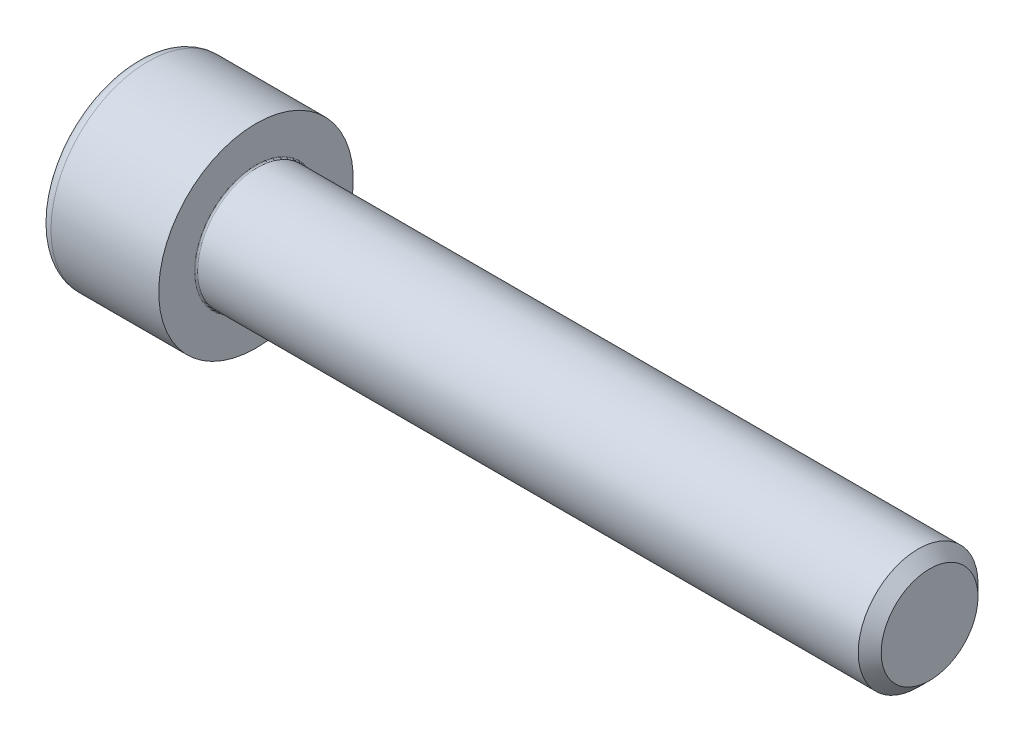
ISO-10303-21;
HEADER;
FILE_DESCRIPTION(('STEP AP214'),'2;1');
FILE_NAME('part.step','',(''),(''),'','','');
FILE_SCHEMA(('AUTOMOTIVE_DESIGN { 1 0 10303 214 1 1 1 1 }'));
ENDSEC;
DATA;
#1=APPLICATION_CONTEXT('core data for automotive mechanical design processes');
#2=APPLICATION_PROTOCOL_DEFINITION('international standard','automotive_design',2000,#1);
#3=PRODUCT_CONTEXT('',#1,'mechanical');
#4=PRODUCT('Part','Part','',(#3));
#5=PRODUCT_RELATED_PRODUCT_CATEGORY('part','',(#4));
#6=PRODUCT_DEFINITION_FORMATION('','',#4);
#7=PRODUCT_DEFINITION_CONTEXT('part definition',#1,'design');
#8=PRODUCT_DEFINITION('design','',#6,#7);
#9=PRODUCT_DEFINITION_SHAPE('','',#8);
#10=(LENGTH_UNIT() NAMED_UNIT(*) SI_UNIT(.MILLI.,.METRE.));
#11=(NAMED_UNIT(*) PLANE_ANGLE_UNIT() SI_UNIT($,.RADIAN.));
#12=(NAMED_UNIT(*) SI_UNIT($,.STERADIAN.) SOLID_ANGLE_UNIT());
#13=UNCERTAINTY_MEASURE_WITH_UNIT(LENGTH_MEASURE(1.E-05),#10,'distance_accuracy_value','');
#14=(GEOMETRIC_REPRESENTATION_CONTEXT(3) GLOBAL_UNCERTAINTY_ASSIGNED_CONTEXT((#13)) GLOBAL_UNIT_ASSIGNED_CONTEXT((#10,
#11,#12)) REPRESENTATION_CONTEXT('',''));
#15=CARTESIAN_POINT('',(0.,0.,0.));
#16=DIRECTION('',(0.,0.,1.));
#17=DIRECTION('',(1.,0.,0.));
#18=AXIS2_PLACEMENT_3D('',#15,#16,#17);
#19=CARTESIAN_POINT('',(-3.,0.,0.));
#20=DIRECTION('',(-1.,0.,0.));
#21=DIRECTION('',(0.,1.,0.));
#22=AXIS2_PLACEMENT_3D('',#19,#20,#21);
#23=CONICAL_SURFACE('',#22,1.73205080756888,1.0471975511966);
#24=DIRECTION('',(-0.5,-0.866025403784438,0.));
#25=VECTOR('',#24,1.);
#26=CARTESIAN_POINT('',(-3.,-1.73205080756888,0.));
#27=LINE('',#26,#25);
#28=CARTESIAN_POINT('',(-2.,0.,0.));
#29=VERTEX_POINT('',#28);
#30=CARTESIAN_POINT('',(-3.73205080756888,-3.,0.));
#31=VERTEX_POINT('',#30);
#32=EDGE_CURVE('E11',#29,#31,#27,.T.);
#33=ORIENTED_EDGE('',*,*,#32,.T.);
#34=CARTESIAN_POINT('',(-3.73205080756888,-3.,0.));
#35=CARTESIAN_POINT('',(-3.73205080756888,-3.,0.80384757729336));
#36=CARTESIAN_POINT('',(-4.,-3.,1.73205080756886));
#37=(BOUNDED_CURVE() B_SPLINE_CURVE(2,(#34,#35,#36),.UNSPECIFIED.,.F.,
.F.) B_SPLINE_CURVE_WITH_KNOTS((3,3),(0.175265420711685,0.350530841423371),
.UNSPECIFIED.) CURVE() GEOMETRIC_REPRESENTATION_ITEM() RATIONAL_B_SPLINE_CURVE((1.07735026918962,
1.07735026918962,1.)) REPRESENTATION_ITEM(''));
#38=CARTESIAN_POINT('',(-4.,-3.,1.73205080756888));
#39=VERTEX_POINT('',#38);
#40=EDGE_CURVE('E177',#31,#39,#37,.T.);
#41=ORIENTED_EDGE('',*,*,#40,.T.);
#42=CARTESIAN_POINT('',(-4.,-3.,1.73205080756889));
#43=CARTESIAN_POINT('',(-3.50000000000001,-1.5,2.59807621135332));
#44=CARTESIAN_POINT('',(-4.,0.,3.46410161513774));
#45=(BOUNDED_CURVE() B_SPLINE_CURVE(2,(#42,#43,#44),.UNSPECIFIED.,.F.,
.F.) B_SPLINE_CURVE_WITH_KNOTS((3,3),(0.,0.350530841423371),
.UNSPECIFIED.) CURVE() GEOMETRIC_REPRESENTATION_ITEM() RATIONAL_B_SPLINE_CURVE((1.,
1.15470053837925,1.)) REPRESENTATION_ITEM(''));
#46=CARTESIAN_POINT('',(-4.,0.,3.46410161513775));
#47=VERTEX_POINT('',#46);
#48=EDGE_CURVE('E28',#39,#47,#45,.T.);
#49=ORIENTED_EDGE('',*,*,#48,.T.);
#50=CARTESIAN_POINT('',(-4.,0.,3.46410161513774));
#51=CARTESIAN_POINT('',(-3.5,1.5,2.59807621135334));
#52=CARTESIAN_POINT('',(-4.,3.,1.73205080756889));
#53=(BOUNDED_CURVE() B_SPLINE_CURVE(2,(#50,#51,#52),.UNSPECIFIED.,.F.,
.F.) B_SPLINE_CURVE_WITH_KNOTS((3,3),(0.,0.350530841423371),
.UNSPECIFIED.) CURVE() GEOMETRIC_REPRESENTATION_ITEM() RATIONAL_B_SPLINE_CURVE((1.,
1.15470053837924,1.)) REPRESENTATION_ITEM(''));
#54=CARTESIAN_POINT('',(-4.,3.,1.73205080756888));
#55=VERTEX_POINT('',#54);
#56=EDGE_CURVE('E170',#47,#55,#53,.T.);
#57=ORIENTED_EDGE('',*,*,#56,.T.);
#58=CARTESIAN_POINT('',(-4.,3.,1.73205080756886));
#59=CARTESIAN_POINT('',(-3.5,3.,0.));
#60=CARTESIAN_POINT('',(-4.,3.,-1.73205080756886));
#61=(BOUNDED_CURVE() B_SPLINE_CURVE(2,(#58,#59,#60),.UNSPECIFIED.,.F.,
.F.) B_SPLINE_CURVE_WITH_KNOTS((3,3),(0.,0.350530841423371),
.UNSPECIFIED.) CURVE() GEOMETRIC_REPRESENTATION_ITEM() RATIONAL_B_SPLINE_CURVE((1.,
1.15470053837924,1.)) REPRESENTATION_ITEM(''));
#62=CARTESIAN_POINT('',(-4.,3.,-1.73205080756888));
#63=VERTEX_POINT('',#62);
#64=EDGE_CURVE('E171',#55,#63,#61,.T.);
#65=ORIENTED_EDGE('',*,*,#64,.T.);
#66=CARTESIAN_POINT('',(-4.,3.,-1.73205080756889));
#67=CARTESIAN_POINT('',(-3.50000000000001,1.5,-2.59807621135332));
#68=CARTESIAN_POINT('',(-4.,0.,-3.46410161513774));
#69=(BOUNDED_CURVE() B_SPLINE_CURVE(2,(#66,#67,#68),.UNSPECIFIED.,.F.,
.F.) B_SPLINE_CURVE_WITH_KNOTS((3,3),(0.,0.350530841423371),
.UNSPECIFIED.) CURVE() GEOMETRIC_REPRESENTATION_ITEM() RATIONAL_B_SPLINE_CURVE((1.,
1.15470053837925,1.)) REPRESENTATION_ITEM(''));
#70=CARTESIAN_POINT('',(-4.,0.,-3.46410161513775));
#71=VERTEX_POINT('',#70);
#72=EDGE_CURVE('E191',#63,#71,#69,.T.);
#73=ORIENTED_EDGE('',*,*,#72,.T.);
#74=CARTESIAN_POINT('',(-4.,0.,-3.46410161513774));
#75=CARTESIAN_POINT('',(-3.5,-1.5,-2.59807621135334));
#76=CARTESIAN_POINT('',(-4.,-3.,-1.73205080756889));
#77=(BOUNDED_CURVE() B_SPLINE_CURVE(2,(#74,#75,#76),.UNSPECIFIED.,.F.,
.F.) B_SPLINE_CURVE_WITH_KNOTS((3,3),(0.,0.350530841423371),
.UNSPECIFIED.) CURVE() GEOMETRIC_REPRESENTATION_ITEM() RATIONAL_B_SPLINE_CURVE((1.,
1.15470053837924,1.)) REPRESENTATION_ITEM(''));
#78=CARTESIAN_POINT('',(-4.,-3.,-1.73205080756888));
#79=VERTEX_POINT('',#78);
#80=EDGE_CURVE('E161',#71,#79,#77,.T.);
#81=ORIENTED_EDGE('',*,*,#80,.T.);
#82=CARTESIAN_POINT('',(-4.,-3.,-1.73205080756885));
#83=CARTESIAN_POINT('',(-3.73205080756888,-3.,-0.80384757729336));
#84=CARTESIAN_POINT('',(-3.73205080756888,-3.,0.));
#85=(BOUNDED_CURVE() B_SPLINE_CURVE(2,(#82,#83,#84),.UNSPECIFIED.,.F.,
.F.) B_SPLINE_CURVE_WITH_KNOTS((3,3),(0.,0.175265420711685),
.UNSPECIFIED.) CURVE() GEOMETRIC_REPRESENTATION_ITEM() RATIONAL_B_SPLINE_CURVE((1.,
1.07735026918962,1.07735026918962)) REPRESENTATION_ITEM(''));
#86=EDGE_CURVE('E211',#79,#31,#85,.T.);
#87=ORIENTED_EDGE('',*,*,#86,.T.);
#88=ORIENTED_EDGE('',*,*,#32,.F.);
#89=EDGE_LOOP('',(#33,#41,#49,#57,#65,#73,#81,#87,#88));
#90=FACE_BOUND('',#89,.T.);
#91=ADVANCED_FACE('F17',(#90),#23,.F.);
#92=CARTESIAN_POINT('',(-8.,-3.,1.73205080756888));
#93=DIRECTION('',(0.,-0.5,0.866025403784439));
#94=DIRECTION('',(-1.,0.,0.));
#95=AXIS2_PLACEMENT_3D('',#92,#93,#94);
#96=PLANE('',#95);
#97=ORIENTED_EDGE('',*,*,#48,.F.);
#98=DIRECTION('',(-1.,0.,0.));
#99=VECTOR('',#98,1.);
#100=CARTESIAN_POINT('',(-6.,-3.,1.73205080756888));
#101=LINE('',#100,#99);
#102=CARTESIAN_POINT('',(-8.,-3.,1.73205080756888));
#103=VERTEX_POINT('',#102);
#104=EDGE_CURVE('E183',#39,#103,#101,.T.);
#105=ORIENTED_EDGE('',*,*,#104,.T.);
#106=DIRECTION('',(0.,-0.866025403784439,-0.5));
#107=VECTOR('',#106,1.);
#108=CARTESIAN_POINT('',(-8.,-2.25,2.1650635094611));
#109=LINE('',#108,#107);
#110=CARTESIAN_POINT('',(-8.,0.,3.46410161513775));
#111=VERTEX_POINT('',#110);
#112=EDGE_CURVE('E176',#111,#103,#109,.T.);
#113=ORIENTED_EDGE('',*,*,#112,.F.);
#114=DIRECTION('',(1.,0.,0.));
#115=VECTOR('',#114,1.);
#116=CARTESIAN_POINT('',(-6.,0.,3.46410161513775));
#117=LINE('',#116,#115);
#118=EDGE_CURVE('E260',#111,#47,#117,.T.);
#119=ORIENTED_EDGE('',*,*,#118,.T.);
#120=EDGE_LOOP('',(#97,#105,#113,#119));
#121=FACE_BOUND('',#120,.T.);
#122=ADVANCED_FACE('F317',(#121),#96,.F.);
#123=CARTESIAN_POINT('',(-8.,-3.,-1.73205080756888));
#124=DIRECTION('',(0.,-1.,0.));
#125=DIRECTION('',(-1.,0.,0.));
#126=AXIS2_PLACEMENT_3D('',#123,#124,#125);
#127=PLANE('',#126);
#128=ORIENTED_EDGE('',*,*,#86,.F.);
#129=DIRECTION('',(-1.,0.,0.));
#130=VECTOR('',#129,1.);
#131=CARTESIAN_POINT('',(-6.,-3.,-1.73205080756888));
#132=LINE('',#131,#130);
#133=CARTESIAN_POINT('',(-8.,-3.,-1.73205080756888));
#134=VERTEX_POINT('',#133);
#135=EDGE_CURVE('E160',#79,#134,#132,.T.);
#136=ORIENTED_EDGE('',*,*,#135,.T.);
#137=DIRECTION('',(0.,0.,-1.));
#138=VECTOR('',#137,1.);
#139=CARTESIAN_POINT('',(-8.,-3.,-0.866025403784438));
#140=LINE('',#139,#138);
#141=EDGE_CURVE('E242',#103,#134,#140,.T.);
#142=ORIENTED_EDGE('',*,*,#141,.F.);
#143=ORIENTED_EDGE('',*,*,#104,.F.);
#144=ORIENTED_EDGE('',*,*,#40,.F.);
#145=EDGE_LOOP('',(#128,#136,#142,#143,#144));
#146=FACE_BOUND('',#145,.T.);
#147=ADVANCED_FACE('F321',(#146),#127,.F.);
#148=CARTESIAN_POINT('',(-8.,0.,3.46410161513775));
#149=DIRECTION('',(0.,0.5,0.866025403784439));
#150=DIRECTION('',(1.,0.,0.));
#151=AXIS2_PLACEMENT_3D('',#148,#149,#150);
#152=PLANE('',#151);
#153=ORIENTED_EDGE('',*,*,#56,.F.);
#154=ORIENTED_EDGE('',*,*,#118,.F.);
#155=DIRECTION('',(0.,-0.866025403784439,0.5));
#156=VECTOR('',#155,1.);
#157=CARTESIAN_POINT('',(-8.,0.75,3.03108891324554));
#158=LINE('',#157,#156);
#159=CARTESIAN_POINT('',(-8.,3.,1.73205080756888));
#160=VERTEX_POINT('',#159);
#161=EDGE_CURVE('E172',#160,#111,#158,.T.);
#162=ORIENTED_EDGE('',*,*,#161,.F.);
#163=DIRECTION('',(-1.,0.,0.));
#164=VECTOR('',#163,1.);
#165=CARTESIAN_POINT('',(-6.,3.,1.73205080756888));
#166=LINE('',#165,#164);
#167=EDGE_CURVE('E166',#55,#160,#166,.T.);
#168=ORIENTED_EDGE('',*,*,#167,.F.);
#169=EDGE_LOOP('',(#153,#154,#162,#168));
#170=FACE_BOUND('',#169,.T.);
#171=ADVANCED_FACE('F315',(#170),#152,.F.);
#172=CARTESIAN_POINT('',(-8.,3.,1.73205080756888));
#173=DIRECTION('',(0.,1.,0.));
#174=DIRECTION('',(0.,0.,-1.));
#175=AXIS2_PLACEMENT_3D('',#172,#173,#174);
#176=PLANE('',#175);
#177=ORIENTED_EDGE('',*,*,#64,.F.);
#178=ORIENTED_EDGE('',*,*,#167,.T.);
#179=DIRECTION('',(0.,0.,1.));
#180=VECTOR('',#179,1.);
#181=CARTESIAN_POINT('',(-8.,3.,0.866025403784437));
#182=LINE('',#181,#180);
#183=CARTESIAN_POINT('',(-8.,3.,-1.73205080756888));
#184=VERTEX_POINT('',#183);
#185=EDGE_CURVE('E155',#184,#160,#182,.T.);
#186=ORIENTED_EDGE('',*,*,#185,.F.);
#187=DIRECTION('',(-1.,0.,0.));
#188=VECTOR('',#187,1.);
#189=CARTESIAN_POINT('',(-6.,3.,-1.73205080756888));
#190=LINE('',#189,#188);
#191=EDGE_CURVE('E196',#63,#184,#190,.T.);
#192=ORIENTED_EDGE('',*,*,#191,.F.);
#193=EDGE_LOOP('',(#177,#178,#186,#192));
#194=FACE_BOUND('',#193,.T.);
#195=ADVANCED_FACE('F312',(#194),#176,.F.);
#196=CARTESIAN_POINT('',(-8.,3.,-1.73205080756888));
#197=DIRECTION('',(0.,0.5,-0.866025403784439));
#198=DIRECTION('',(-1.,0.,0.));
#199=AXIS2_PLACEMENT_3D('',#196,#197,#198);
#200=PLANE('',#199);
#201=ORIENTED_EDGE('',*,*,#72,.F.);
#202=ORIENTED_EDGE('',*,*,#191,.T.);
#203=DIRECTION('',(0.,0.866025403784439,0.5));
#204=VECTOR('',#203,1.);
#205=CARTESIAN_POINT('',(-8.,2.25,-2.1650635094611));
#206=LINE('',#205,#204);
#207=CARTESIAN_POINT('',(-8.,0.,-3.46410161513775));
#208=VERTEX_POINT('',#207);
#209=EDGE_CURVE('E190',#208,#184,#206,.T.);
#210=ORIENTED_EDGE('',*,*,#209,.F.);
#211=DIRECTION('',(-1.,0.,0.));
#212=VECTOR('',#211,1.);
#213=CARTESIAN_POINT('',(-6.,0.,-3.46410161513775));
#214=LINE('',#213,#212);
#215=EDGE_CURVE('E157',#71,#208,#214,.T.);
#216=ORIENTED_EDGE('',*,*,#215,.F.);
#217=EDGE_LOOP('',(#201,#202,#210,#216));
#218=FACE_BOUND('',#217,.T.);
#219=ADVANCED_FACE('F302',(#218),#200,.F.);
#220=CARTESIAN_POINT('',(-8.,0.,-3.46410161513775));
#221=DIRECTION('',(0.,-0.5,-0.866025403784439));
#222=DIRECTION('',(0.,-0.866025403784439,0.5));
#223=AXIS2_PLACEMENT_3D('',#220,#221,#222);
#224=PLANE('',#223);
#225=ORIENTED_EDGE('',*,*,#80,.F.);
#226=ORIENTED_EDGE('',*,*,#215,.T.);
#227=DIRECTION('',(0.,0.866025403784439,-0.5));
#228=VECTOR('',#227,1.);
#229=CARTESIAN_POINT('',(-8.,-0.75,-3.03108891324554));
#230=LINE('',#229,#228);
#231=EDGE_CURVE('E151',#134,#208,#230,.T.);
#232=ORIENTED_EDGE('',*,*,#231,.F.);
#233=ORIENTED_EDGE('',*,*,#135,.F.);
#234=EDGE_LOOP('',(#225,#226,#232,#233));
#235=FACE_BOUND('',#234,.T.);
#236=ADVANCED_FACE('F325',(#235),#224,.F.);
#237=CARTESIAN_POINT('',(-4.,0.,0.));
#238=DIRECTION('',(1.,0.,0.));
#239=DIRECTION('',(0.,1.,0.));
#240=AXIS2_PLACEMENT_3D('',#237,#238,#239);
#241=CYLINDRICAL_SURFACE('',#240,6.5);
#242=CARTESIAN_POINT('',(0.,0.,0.));
#243=DIRECTION('',(1.,0.,0.));
#244=DIRECTION('',(0.,1.,0.));
#245=AXIS2_PLACEMENT_3D('',#242,#243,#244);
#246=CIRCLE('',#245,6.5);
#247=CARTESIAN_POINT('',(0.,-6.5,0.));
#248=VERTEX_POINT('',#247);
#249=EDGE_CURVE('E202',#248,#248,#246,.T.);
#250=ORIENTED_EDGE('',*,*,#249,.F.);
#251=DIRECTION('',(-1.,0.,0.));
#252=VECTOR('',#251,1.);
#253=CARTESIAN_POINT('',(-4.,-6.5,0.));
#254=LINE('',#253,#252);
#255=CARTESIAN_POINT('',(-7.2,-6.5,0.));
#256=VERTEX_POINT('',#255);
#257=EDGE_CURVE('E184',#248,#256,#254,.T.);
#258=ORIENTED_EDGE('',*,*,#257,.T.);
#259=CARTESIAN_POINT('',(-7.2,0.,0.));
#260=DIRECTION('',(-1.,0.,0.));
#261=DIRECTION('',(0.,-1.,0.));
#262=AXIS2_PLACEMENT_3D('',#259,#260,#261);
#263=CIRCLE('',#262,6.5);
#264=CARTESIAN_POINT('',(-7.2,0.,6.5));
#265=VERTEX_POINT('',#264);
#266=EDGE_CURVE('E203',#265,#256,#263,.T.);
#267=ORIENTED_EDGE('',*,*,#266,.F.);
#268=CARTESIAN_POINT('',(-7.2,0.,0.));
#269=DIRECTION('',(-1.,0.,0.));
#270=DIRECTION('',(0.,-1.,0.));
#271=AXIS2_PLACEMENT_3D('',#268,#269,#270);
#272=CIRCLE('',#271,6.5);
#273=EDGE_CURVE('E207',#256,#265,#272,.T.);
#274=ORIENTED_EDGE('',*,*,#273,.F.);
#275=ORIENTED_EDGE('',*,*,#257,.F.);
#276=EDGE_LOOP('',(#250,#258,#267,#274,#275));
#277=FACE_BOUND('',#276,.T.);
#278=ADVANCED_FACE('F19',(#277),#241,.T.);
#279=CARTESIAN_POINT('',(-8.,4.98205080756888,0.));
#280=DIRECTION('',(-1.,0.,0.));
#281=DIRECTION('',(0.,0.,1.));
#282=AXIS2_PLACEMENT_3D('',#279,#280,#281);
#283=PLANE('',#282);
#284=ORIENTED_EDGE('',*,*,#185,.T.);
#285=ORIENTED_EDGE('',*,*,#161,.T.);
#286=ORIENTED_EDGE('',*,*,#112,.T.);
#287=ORIENTED_EDGE('',*,*,#141,.T.);
#288=ORIENTED_EDGE('',*,*,#231,.T.);
#289=ORIENTED_EDGE('',*,*,#209,.T.);
#290=EDGE_LOOP('',(#284,#285,#286,#287,#288,#289));
#291=FACE_BOUND('',#290,.T.);
#292=CARTESIAN_POINT('',(-8.,0.,0.));
#293=DIRECTION('',(1.,0.,0.));
#294=DIRECTION('',(0.,-1.,0.));
#295=AXIS2_PLACEMENT_3D('',#292,#293,#294);
#296=CIRCLE('',#295,5.7);
#297=CARTESIAN_POINT('',(-8.,0.,5.7));
#298=VERTEX_POINT('',#297);
#299=EDGE_CURVE('E153',#298,#298,#296,.T.);
#300=ORIENTED_EDGE('',*,*,#299,.F.);
#301=EDGE_LOOP('',(#300));
#302=FACE_BOUND('',#301,.T.);
#303=ADVANCED_FACE('F309',(#291,#302),#283,.T.);
#304=CARTESIAN_POINT('',(-7.2,0.,0.));
#305=DIRECTION('',(1.,0.,0.));
#306=DIRECTION('',(0.,0.,-1.));
#307=AXIS2_PLACEMENT_3D('',#304,#305,#306);
#308=TOROIDAL_SURFACE('',#307,5.7,0.8);
#309=ORIENTED_EDGE('',*,*,#266,.T.);
#310=ORIENTED_EDGE('',*,*,#273,.T.);
#311=CARTESIAN_POINT('',(-7.2,0.,5.7));
#312=DIRECTION('',(0.,-1.,0.));
#313=DIRECTION('',(0.,0.,1.));
#314=AXIS2_PLACEMENT_3D('',#311,#312,#313);
#315=CIRCLE('',#314,0.8);
#316=EDGE_CURVE('E156',#265,#298,#315,.T.);
#317=ORIENTED_EDGE('',*,*,#316,.T.);
#318=ORIENTED_EDGE('',*,*,#299,.T.);
#319=ORIENTED_EDGE('',*,*,#316,.F.);
#320=EDGE_LOOP('',(#309,#310,#317,#318,#319));
#321=FACE_BOUND('',#320,.T.);
#322=ADVANCED_FACE('F352',(#321),#308,.T.);
#323=CARTESIAN_POINT('',(45.,2.,0.));
#324=DIRECTION('',(1.,0.,0.));
#325=DIRECTION('',(0.,-1.,0.));
#326=AXIS2_PLACEMENT_3D('',#323,#324,#325);
#327=PLANE('',#326);
#328=CARTESIAN_POINT('',(45.,0.,0.));
#329=DIRECTION('',(-1.,0.,0.));
#330=DIRECTION('',(0.,-1.,0.));
#331=AXIS2_PLACEMENT_3D('',#328,#329,#330);
#332=CIRCLE('',#331,3.2331875);
#333=CARTESIAN_POINT('',(45.,3.2331875,0.));
#334=VERTEX_POINT('',#333);
#335=EDGE_CURVE('E218',#334,#334,#332,.T.);
#336=ORIENTED_EDGE('',*,*,#335,.F.);
#337=EDGE_LOOP('',(#336));
#338=FACE_BOUND('',#337,.T.);
#339=ADVANCED_FACE('F350',(#338),#327,.T.);
#340=CARTESIAN_POINT('',(44.61659375,0.,0.));
#341=DIRECTION('',(-1.,0.,0.));
#342=DIRECTION('',(0.,-1.,0.));
#343=AXIS2_PLACEMENT_3D('',#340,#341,#342);
#344=CONICAL_SURFACE('',#343,3.61659375,0.785398163397448);
#345=ORIENTED_EDGE('',*,*,#335,.T.);
#346=DIRECTION('',(-0.707106781186548,0.707106781186548,0.));
#347=VECTOR('',#346,1.);
#348=CARTESIAN_POINT('',(44.61659375,3.61659375,0.));
#349=LINE('',#348,#347);
#350=CARTESIAN_POINT('',(44.2331875,4.,0.));
#351=VERTEX_POINT('',#350);
#352=EDGE_CURVE('E208',#334,#351,#349,.T.);
#353=ORIENTED_EDGE('',*,*,#352,.T.);
#354=CARTESIAN_POINT('',(44.2331875,0.,0.));
#355=DIRECTION('',(1.,0.,0.));
#356=DIRECTION('',(0.,-1.,0.));
#357=AXIS2_PLACEMENT_3D('',#354,#355,#356);
#358=CIRCLE('',#357,4.);
#359=CARTESIAN_POINT('',(44.2331875,-4.,0.));
#360=VERTEX_POINT('',#359);
#361=EDGE_CURVE('E130',#351,#360,#358,.T.);
#362=ORIENTED_EDGE('',*,*,#361,.T.);
#363=CARTESIAN_POINT('',(44.2331875,0.,0.));
#364=DIRECTION('',(1.,0.,0.));
#365=DIRECTION('',(0.,-1.,0.));
#366=AXIS2_PLACEMENT_3D('',#363,#364,#365);
#367=CIRCLE('',#366,4.);
#368=EDGE_CURVE('E165',#360,#351,#367,.T.);
#369=ORIENTED_EDGE('',*,*,#368,.T.);
#370=ORIENTED_EDGE('',*,*,#352,.F.);
#371=EDGE_LOOP('',(#345,#353,#362,#369,#370));
#372=FACE_BOUND('',#371,.T.);
#373=ADVANCED_FACE('F342',(#372),#344,.T.);
#374=CARTESIAN_POINT('',(0.,5.25,0.));
#375=DIRECTION('',(1.,0.,0.));
#376=DIRECTION('',(0.,-1.,0.));
#377=AXIS2_PLACEMENT_3D('',#374,#375,#376);
#378=PLANE('',#377);
#379=CARTESIAN_POINT('',(0.,0.,0.));
#380=DIRECTION('',(1.,0.,0.));
#381=DIRECTION('',(0.,-1.,0.));
#382=AXIS2_PLACEMENT_3D('',#379,#380,#381);
#383=CIRCLE('',#382,4.1);
#384=CARTESIAN_POINT('',(0.,0.,4.1));
#385=VERTEX_POINT('',#384);
#386=EDGE_CURVE('E139',#385,#385,#383,.T.);
#387=ORIENTED_EDGE('',*,*,#386,.F.);
#388=EDGE_LOOP('',(#387));
#389=FACE_BOUND('',#388,.T.);
#390=ORIENTED_EDGE('',*,*,#249,.T.);
#391=EDGE_LOOP('',(#390));
#392=FACE_BOUND('',#391,.T.);
#393=ADVANCED_FACE('F339',(#389,#392),#378,.T.);
#394=CARTESIAN_POINT('',(34.,0.,0.));
#395=DIRECTION('',(1.,0.,0.));
#396=DIRECTION('',(0.,1.,0.));
#397=AXIS2_PLACEMENT_3D('',#394,#395,#396);
#398=CYLINDRICAL_SURFACE('',#397,4.);
#399=ORIENTED_EDGE('',*,*,#361,.F.);
#400=ORIENTED_EDGE('',*,*,#368,.F.);
#401=DIRECTION('',(-1.,0.,0.));
#402=VECTOR('',#401,1.);
#403=CARTESIAN_POINT('',(34.,-4.,0.));
#404=LINE('',#403,#402);
#405=CARTESIAN_POINT('',(0.100000000000002,-4.,0.));
#406=VERTEX_POINT('',#405);
#407=EDGE_CURVE('E135',#360,#406,#404,.T.);
#408=ORIENTED_EDGE('',*,*,#407,.T.);
#409=CARTESIAN_POINT('',(0.100000000000002,0.,0.));
#410=DIRECTION('',(-1.,0.,0.));
#411=DIRECTION('',(0.,-1.,0.));
#412=AXIS2_PLACEMENT_3D('',#409,#410,#411);
#413=CIRCLE('',#412,4.);
#414=CARTESIAN_POINT('',(0.100000000000002,0.,4.));
#415=VERTEX_POINT('',#414);
#416=EDGE_CURVE('E127',#415,#406,#413,.T.);
#417=ORIENTED_EDGE('',*,*,#416,.F.);
#418=CARTESIAN_POINT('',(0.100000000000002,0.,0.));
#419=DIRECTION('',(-1.,0.,0.));
#420=DIRECTION('',(0.,-1.,0.));
#421=AXIS2_PLACEMENT_3D('',#418,#419,#420);
#422=CIRCLE('',#421,4.);
#423=EDGE_CURVE('E122',#406,#415,#422,.T.);
#424=ORIENTED_EDGE('',*,*,#423,.F.);
#425=ORIENTED_EDGE('',*,*,#407,.F.);
#426=EDGE_LOOP('',(#399,#400,#408,#417,#424,#425));
#427=FACE_BOUND('',#426,.T.);
#428=ADVANCED_FACE('F133',(#427),#398,.T.);
#429=CARTESIAN_POINT('',(0.100000000000002,0.,0.));
#430=DIRECTION('',(1.,0.,0.));
#431=DIRECTION('',(0.,0.,-1.));
#432=AXIS2_PLACEMENT_3D('',#429,#430,#431);
#433=TOROIDAL_SURFACE('',#432,4.1,0.1);
#434=ORIENTED_EDGE('',*,*,#386,.T.);
#435=CARTESIAN_POINT('',(0.100000000000002,0.,4.1));
#436=DIRECTION('',(0.,-1.,0.));
#437=DIRECTION('',(0.,0.,1.));
#438=AXIS2_PLACEMENT_3D('',#435,#436,#437);
#439=CIRCLE('',#438,0.1);
#440=EDGE_CURVE('E21',#385,#415,#439,.T.);
#441=ORIENTED_EDGE('',*,*,#440,.T.);
#442=ORIENTED_EDGE('',*,*,#416,.T.);
#443=ORIENTED_EDGE('',*,*,#423,.T.);
#444=ORIENTED_EDGE('',*,*,#440,.F.);
#445=EDGE_LOOP('',(#434,#441,#442,#443,#444));
#446=FACE_BOUND('',#445,.T.);
#447=ADVANCED_FACE('F125',(#446),#433,.F.);
#448=CLOSED_SHELL('',(#91,#122,#147,#171,#195,#219,#236,#278,#303,#322,#339,#373,#393,#428,#447));
#449=MANIFOLD_SOLID_BREP('B1',#448);
#450=ADVANCED_BREP_SHAPE_REPRESENTATION('',(#18,#449),#14);
#451=SHAPE_DEFINITION_REPRESENTATION(#9,#450);
ENDSEC;
END-ISO-10303-21;
